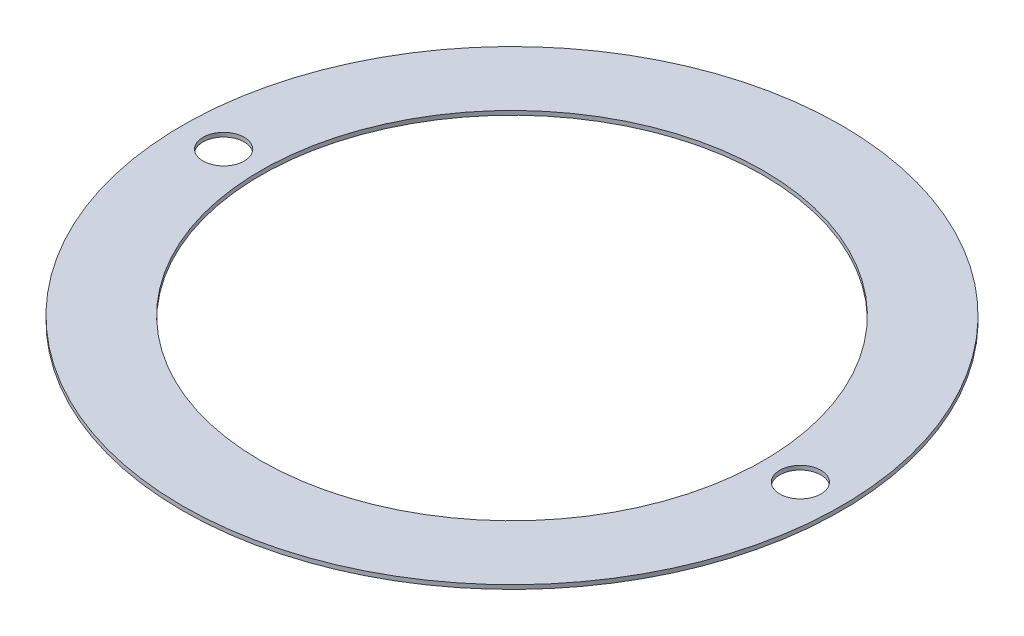
ISO-10303-21;
HEADER;
FILE_DESCRIPTION(('STEP AP214'),'2;1');
FILE_NAME('part.step','',(''),(''),'','','');
FILE_SCHEMA(('AUTOMOTIVE_DESIGN { 1 0 10303 214 1 1 1 1 }'));
ENDSEC;
DATA;
#1=APPLICATION_CONTEXT('core data for automotive mechanical design processes');
#2=APPLICATION_PROTOCOL_DEFINITION('international standard','automotive_design',2000,#1);
#3=PRODUCT_CONTEXT('',#1,'mechanical');
#4=PRODUCT('Part','Part','',(#3));
#5=PRODUCT_RELATED_PRODUCT_CATEGORY('part','',(#4));
#6=PRODUCT_DEFINITION_FORMATION('','',#4);
#7=PRODUCT_DEFINITION_CONTEXT('part definition',#1,'design');
#8=PRODUCT_DEFINITION('design','',#6,#7);
#9=PRODUCT_DEFINITION_SHAPE('','',#8);
#10=(LENGTH_UNIT() NAMED_UNIT(*) SI_UNIT(.MILLI.,.METRE.));
#11=(NAMED_UNIT(*) PLANE_ANGLE_UNIT() SI_UNIT($,.RADIAN.));
#12=(NAMED_UNIT(*) SI_UNIT($,.STERADIAN.) SOLID_ANGLE_UNIT());
#13=UNCERTAINTY_MEASURE_WITH_UNIT(LENGTH_MEASURE(1.E-05),#10,'distance_accuracy_value','');
#14=(GEOMETRIC_REPRESENTATION_CONTEXT(3) GLOBAL_UNCERTAINTY_ASSIGNED_CONTEXT((#13)) GLOBAL_UNIT_ASSIGNED_CONTEXT((#10,
#11,#12)) REPRESENTATION_CONTEXT('',''));
#15=CARTESIAN_POINT('',(0.,0.,0.));
#16=DIRECTION('',(0.,0.,1.));
#17=DIRECTION('',(1.,0.,0.));
#18=AXIS2_PLACEMENT_3D('',#15,#16,#17);
#19=CARTESIAN_POINT('',(0.,0.1,0.));
#20=DIRECTION('',(0.,1.,0.));
#21=DIRECTION('',(0.,0.,1.));
#22=AXIS2_PLACEMENT_3D('',#19,#20,#21);
#23=PLANE('',#22);
#24=CARTESIAN_POINT('',(-7.,0.1,0.));
#25=DIRECTION('',(0.,1.,0.));
#26=DIRECTION('',(0.,0.,1.));
#27=AXIS2_PLACEMENT_3D('',#24,#25,#26);
#28=CIRCLE('',#27,0.5);
#29=CARTESIAN_POINT('',(-7.,0.1,0.5));
#30=VERTEX_POINT('',#29);
#31=EDGE_CURVE('E58',#30,#30,#28,.T.);
#32=ORIENTED_EDGE('',*,*,#31,.F.);
#33=EDGE_LOOP('',(#32));
#34=FACE_BOUND('',#33,.T.);
#35=CARTESIAN_POINT('',(7.,0.1,0.));
#36=DIRECTION('',(0.,1.,0.));
#37=DIRECTION('',(0.,0.,1.));
#38=AXIS2_PLACEMENT_3D('',#35,#36,#37);
#39=CIRCLE('',#38,0.5);
#40=CARTESIAN_POINT('',(7.,0.1,0.5));
#41=VERTEX_POINT('',#40);
#42=EDGE_CURVE('E52',#41,#41,#39,.T.);
#43=ORIENTED_EDGE('',*,*,#42,.F.);
#44=EDGE_LOOP('',(#43));
#45=FACE_BOUND('',#44,.T.);
#46=CARTESIAN_POINT('',(0.,0.1,0.));
#47=DIRECTION('',(0.,1.,0.));
#48=DIRECTION('',(0.,0.,1.));
#49=AXIS2_PLACEMENT_3D('',#46,#47,#48);
#50=CIRCLE('',#49,8.);
#51=CARTESIAN_POINT('',(0.,0.1,8.));
#52=VERTEX_POINT('',#51);
#53=EDGE_CURVE('E10',#52,#52,#50,.T.);
#54=ORIENTED_EDGE('',*,*,#53,.T.);
#55=EDGE_LOOP('',(#54));
#56=FACE_BOUND('',#55,.T.);
#57=CARTESIAN_POINT('',(0.,0.1,0.));
#58=DIRECTION('',(0.,1.,0.));
#59=DIRECTION('',(0.,0.,1.));
#60=AXIS2_PLACEMENT_3D('',#57,#58,#59);
#61=CIRCLE('',#60,6.1);
#62=CARTESIAN_POINT('',(0.,0.1,6.1));
#63=VERTEX_POINT('',#62);
#64=EDGE_CURVE('E42',#63,#63,#61,.T.);
#65=ORIENTED_EDGE('',*,*,#64,.F.);
#66=EDGE_LOOP('',(#65));
#67=FACE_BOUND('',#66,.T.);
#68=ADVANCED_FACE('F31',(#34,#45,#56,#67),#23,.T.);
#69=CARTESIAN_POINT('',(0.,0.,0.));
#70=DIRECTION('',(0.,1.,0.));
#71=DIRECTION('',(0.,0.,1.));
#72=AXIS2_PLACEMENT_3D('',#69,#70,#71);
#73=PLANE('',#72);
#74=CARTESIAN_POINT('',(-7.,0.,0.));
#75=DIRECTION('',(0.,1.,0.));
#76=DIRECTION('',(0.,0.,1.));
#77=AXIS2_PLACEMENT_3D('',#74,#75,#76);
#78=CIRCLE('',#77,0.5);
#79=CARTESIAN_POINT('',(-7.,0.,0.5));
#80=VERTEX_POINT('',#79);
#81=EDGE_CURVE('E55',#80,#80,#78,.T.);
#82=ORIENTED_EDGE('',*,*,#81,.T.);
#83=EDGE_LOOP('',(#82));
#84=FACE_BOUND('',#83,.T.);
#85=CARTESIAN_POINT('',(7.,0.,0.));
#86=DIRECTION('',(0.,1.,0.));
#87=DIRECTION('',(0.,0.,1.));
#88=AXIS2_PLACEMENT_3D('',#85,#86,#87);
#89=CIRCLE('',#88,0.5);
#90=CARTESIAN_POINT('',(7.,0.,0.5));
#91=VERTEX_POINT('',#90);
#92=EDGE_CURVE('E47',#91,#91,#89,.T.);
#93=ORIENTED_EDGE('',*,*,#92,.T.);
#94=EDGE_LOOP('',(#93));
#95=FACE_BOUND('',#94,.T.);
#96=CARTESIAN_POINT('',(0.,0.,0.));
#97=DIRECTION('',(0.,1.,0.));
#98=DIRECTION('',(0.,0.,1.));
#99=AXIS2_PLACEMENT_3D('',#96,#97,#98);
#100=CIRCLE('',#99,8.);
#101=CARTESIAN_POINT('',(0.,0.,8.));
#102=VERTEX_POINT('',#101);
#103=EDGE_CURVE('E35',#102,#102,#100,.T.);
#104=ORIENTED_EDGE('',*,*,#103,.F.);
#105=EDGE_LOOP('',(#104));
#106=FACE_BOUND('',#105,.T.);
#107=CARTESIAN_POINT('',(0.,0.,0.));
#108=DIRECTION('',(0.,1.,0.));
#109=DIRECTION('',(0.,0.,1.));
#110=AXIS2_PLACEMENT_3D('',#107,#108,#109);
#111=CIRCLE('',#110,6.1);
#112=CARTESIAN_POINT('',(0.,0.,6.1));
#113=VERTEX_POINT('',#112);
#114=EDGE_CURVE('E44',#113,#113,#111,.T.);
#115=ORIENTED_EDGE('',*,*,#114,.T.);
#116=EDGE_LOOP('',(#115));
#117=FACE_BOUND('',#116,.T.);
#118=ADVANCED_FACE('F66',(#84,#95,#106,#117),#73,.F.);
#119=CARTESIAN_POINT('',(0.,0.1,0.));
#120=DIRECTION('',(0.,-1.,0.));
#121=DIRECTION('',(0.,0.,-1.));
#122=AXIS2_PLACEMENT_3D('',#119,#120,#121);
#123=CYLINDRICAL_SURFACE('',#122,8.);
#124=ORIENTED_EDGE('',*,*,#53,.F.);
#125=EDGE_LOOP('',(#124));
#126=FACE_BOUND('',#125,.T.);
#127=ORIENTED_EDGE('',*,*,#103,.T.);
#128=EDGE_LOOP('',(#127));
#129=FACE_BOUND('',#128,.T.);
#130=ADVANCED_FACE('F33',(#126,#129),#123,.T.);
#131=CARTESIAN_POINT('',(0.,0.1,0.));
#132=DIRECTION('',(0.,-1.,0.));
#133=DIRECTION('',(0.,0.,-1.));
#134=AXIS2_PLACEMENT_3D('',#131,#132,#133);
#135=CYLINDRICAL_SURFACE('',#134,6.1);
#136=ORIENTED_EDGE('',*,*,#64,.T.);
#137=EDGE_LOOP('',(#136));
#138=FACE_BOUND('',#137,.T.);
#139=ORIENTED_EDGE('',*,*,#114,.F.);
#140=EDGE_LOOP('',(#139));
#141=FACE_BOUND('',#140,.T.);
#142=ADVANCED_FACE('F72',(#138,#141),#135,.F.);
#143=CARTESIAN_POINT('',(7.,0.1,0.));
#144=DIRECTION('',(0.,1.,0.));
#145=DIRECTION('',(0.,0.,1.));
#146=AXIS2_PLACEMENT_3D('',#143,#144,#145);
#147=CYLINDRICAL_SURFACE('',#146,0.5);
#148=ORIENTED_EDGE('',*,*,#92,.F.);
#149=EDGE_LOOP('',(#148));
#150=FACE_BOUND('',#149,.T.);
#151=ORIENTED_EDGE('',*,*,#42,.T.);
#152=EDGE_LOOP('',(#151));
#153=FACE_BOUND('',#152,.T.);
#154=ADVANCED_FACE('F75',(#150,#153),#147,.F.);
#155=CARTESIAN_POINT('',(-7.,0.1,0.));
#156=DIRECTION('',(0.,1.,0.));
#157=DIRECTION('',(0.,0.,1.));
#158=AXIS2_PLACEMENT_3D('',#155,#156,#157);
#159=CYLINDRICAL_SURFACE('',#158,0.5);
#160=ORIENTED_EDGE('',*,*,#81,.F.);
#161=EDGE_LOOP('',(#160));
#162=FACE_BOUND('',#161,.T.);
#163=ORIENTED_EDGE('',*,*,#31,.T.);
#164=EDGE_LOOP('',(#163));
#165=FACE_BOUND('',#164,.T.);
#166=ADVANCED_FACE('F62',(#162,#165),#159,.F.);
#167=CLOSED_SHELL('',(#68,#118,#130,#142,#154,#166));
#168=MANIFOLD_SOLID_BREP('B2',#167);
#169=ADVANCED_BREP_SHAPE_REPRESENTATION('',(#18,#168),#14);
#170=SHAPE_DEFINITION_REPRESENTATION(#9,#169);
ENDSEC;
END-ISO-10303-21;
